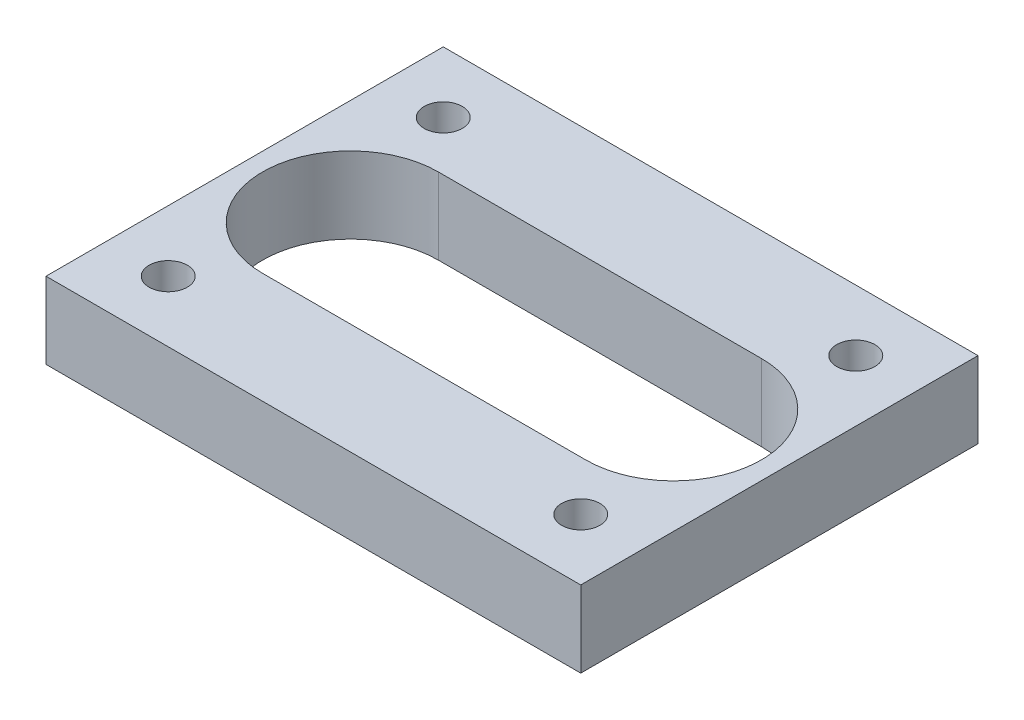
ISO-10303-21;
HEADER;
FILE_DESCRIPTION(('STEP AP214'),'2;1');
FILE_NAME('part.step','',(''),(''),'','','');
FILE_SCHEMA(('AUTOMOTIVE_DESIGN { 1 0 10303 214 1 1 1 1 }'));
ENDSEC;
DATA;
#1=APPLICATION_CONTEXT('core data for automotive mechanical design processes');
#2=APPLICATION_PROTOCOL_DEFINITION('international standard','automotive_design',2000,#1);
#3=PRODUCT_CONTEXT('',#1,'mechanical');
#4=PRODUCT('Part','Part','',(#3));
#5=PRODUCT_RELATED_PRODUCT_CATEGORY('part','',(#4));
#6=PRODUCT_DEFINITION_FORMATION('','',#4);
#7=PRODUCT_DEFINITION_CONTEXT('part definition',#1,'design');
#8=PRODUCT_DEFINITION('design','',#6,#7);
#9=PRODUCT_DEFINITION_SHAPE('','',#8);
#10=(LENGTH_UNIT() NAMED_UNIT(*) SI_UNIT(.MILLI.,.METRE.));
#11=(NAMED_UNIT(*) PLANE_ANGLE_UNIT() SI_UNIT($,.RADIAN.));
#12=(NAMED_UNIT(*) SI_UNIT($,.STERADIAN.) SOLID_ANGLE_UNIT());
#13=UNCERTAINTY_MEASURE_WITH_UNIT(LENGTH_MEASURE(1.E-05),#10,'distance_accuracy_value','');
#14=(GEOMETRIC_REPRESENTATION_CONTEXT(3) GLOBAL_UNCERTAINTY_ASSIGNED_CONTEXT((#13)) GLOBAL_UNIT_ASSIGNED_CONTEXT((#10,
#11,#12)) REPRESENTATION_CONTEXT('',''));
#15=CARTESIAN_POINT('',(0.,0.,0.));
#16=DIRECTION('',(0.,0.,1.));
#17=DIRECTION('',(1.,0.,0.));
#18=AXIS2_PLACEMENT_3D('',#15,#16,#17);
#19=CARTESIAN_POINT('',(0.,130.,86.));
#20=DIRECTION('',(0.,0.,-1.));
#21=DIRECTION('',(-1.,0.,0.));
#22=AXIS2_PLACEMENT_3D('',#19,#20,#21);
#23=PLANE('',#22);
#24=DIRECTION('',(-1.,0.,0.));
#25=VECTOR('',#24,1.);
#26=CARTESIAN_POINT('',(0.,140.,86.));
#27=LINE('',#26,#25);
#28=CARTESIAN_POINT('',(-147.526760947637,140.,86.));
#29=VERTEX_POINT('',#28);
#30=CARTESIAN_POINT('',(-217.526760947637,140.,86.));
#31=VERTEX_POINT('',#30);
#32=EDGE_CURVE('E61',#29,#31,#27,.T.);
#33=ORIENTED_EDGE('',*,*,#32,.T.);
#34=DIRECTION('',(0.,1.,0.));
#35=VECTOR('',#34,1.);
#36=CARTESIAN_POINT('',(-217.526760947637,130.,86.));
#37=LINE('',#36,#35);
#38=CARTESIAN_POINT('',(-217.526760947637,130.,86.));
#39=VERTEX_POINT('',#38);
#40=EDGE_CURVE('E164',#39,#31,#37,.T.);
#41=ORIENTED_EDGE('',*,*,#40,.F.);
#42=DIRECTION('',(-1.,0.,0.));
#43=VECTOR('',#42,1.);
#44=CARTESIAN_POINT('',(0.,130.,86.));
#45=LINE('',#44,#43);
#46=CARTESIAN_POINT('',(-147.526760947637,130.,86.));
#47=VERTEX_POINT('',#46);
#48=EDGE_CURVE('E138',#47,#39,#45,.T.);
#49=ORIENTED_EDGE('',*,*,#48,.F.);
#50=DIRECTION('',(0.,1.,0.));
#51=VECTOR('',#50,1.);
#52=CARTESIAN_POINT('',(-147.526760947637,130.,86.));
#53=LINE('',#52,#51);
#54=EDGE_CURVE('E159',#47,#29,#53,.T.);
#55=ORIENTED_EDGE('',*,*,#54,.T.);
#56=EDGE_LOOP('',(#33,#41,#49,#55));
#57=FACE_BOUND('',#56,.T.);
#58=ADVANCED_FACE('F39',(#57),#23,.F.);
#59=CARTESIAN_POINT('',(-217.526760947637,130.,0.));
#60=DIRECTION('',(1.,0.,0.));
#61=DIRECTION('',(0.,0.,-1.));
#62=AXIS2_PLACEMENT_3D('',#59,#60,#61);
#63=PLANE('',#62);
#64=DIRECTION('',(0.,0.,-1.));
#65=VECTOR('',#64,1.);
#66=CARTESIAN_POINT('',(-217.526760947637,140.,0.));
#67=LINE('',#66,#65);
#68=CARTESIAN_POINT('',(-217.526760947637,140.,34.));
#69=VERTEX_POINT('',#68);
#70=EDGE_CURVE('E125',#31,#69,#67,.T.);
#71=ORIENTED_EDGE('',*,*,#70,.T.);
#72=DIRECTION('',(0.,1.,0.));
#73=VECTOR('',#72,1.);
#74=CARTESIAN_POINT('',(-217.526760947637,130.,34.));
#75=LINE('',#74,#73);
#76=CARTESIAN_POINT('',(-217.526760947637,130.,34.));
#77=VERTEX_POINT('',#76);
#78=EDGE_CURVE('E162',#77,#69,#75,.T.);
#79=ORIENTED_EDGE('',*,*,#78,.F.);
#80=DIRECTION('',(0.,0.,-1.));
#81=VECTOR('',#80,1.);
#82=CARTESIAN_POINT('',(-217.526760947637,130.,0.));
#83=LINE('',#82,#81);
#84=EDGE_CURVE('E141',#39,#77,#83,.T.);
#85=ORIENTED_EDGE('',*,*,#84,.F.);
#86=ORIENTED_EDGE('',*,*,#40,.T.);
#87=EDGE_LOOP('',(#71,#79,#85,#86));
#88=FACE_BOUND('',#87,.T.);
#89=ADVANCED_FACE('F187',(#88),#63,.F.);
#90=CARTESIAN_POINT('',(-161.376760947637,130.,60.));
#91=DIRECTION('',(0.,1.,0.));
#92=DIRECTION('',(0.,0.,1.));
#93=AXIS2_PLACEMENT_3D('',#90,#91,#92);
#94=CYLINDRICAL_SURFACE('',#93,11.5);
#95=CARTESIAN_POINT('',(-161.376760947637,140.,60.));
#96=DIRECTION('',(0.,-1.,0.));
#97=DIRECTION('',(0.,0.,-1.));
#98=AXIS2_PLACEMENT_3D('',#95,#96,#97);
#99=CIRCLE('',#98,11.5);
#100=CARTESIAN_POINT('',(-161.376760947637,140.,48.5));
#101=VERTEX_POINT('',#100);
#102=CARTESIAN_POINT('',(-161.376760947637,140.,71.5));
#103=VERTEX_POINT('',#102);
#104=EDGE_CURVE('E151',#101,#103,#99,.T.);
#105=ORIENTED_EDGE('',*,*,#104,.F.);
#106=DIRECTION('',(0.,1.,0.));
#107=VECTOR('',#106,1.);
#108=CARTESIAN_POINT('',(-161.376760947637,130.,48.5));
#109=LINE('',#108,#107);
#110=CARTESIAN_POINT('',(-161.376760947637,130.,48.5));
#111=VERTEX_POINT('',#110);
#112=EDGE_CURVE('E170',#111,#101,#109,.T.);
#113=ORIENTED_EDGE('',*,*,#112,.F.);
#114=CARTESIAN_POINT('',(-161.376760947637,130.,60.));
#115=DIRECTION('',(0.,-1.,0.));
#116=DIRECTION('',(0.,0.,-1.));
#117=AXIS2_PLACEMENT_3D('',#114,#115,#116);
#118=CIRCLE('',#117,11.5);
#119=CARTESIAN_POINT('',(-161.376760947637,130.,71.5));
#120=VERTEX_POINT('',#119);
#121=EDGE_CURVE('E129',#111,#120,#118,.T.);
#122=ORIENTED_EDGE('',*,*,#121,.T.);
#123=DIRECTION('',(0.,1.,0.));
#124=VECTOR('',#123,1.);
#125=CARTESIAN_POINT('',(-161.376760947637,130.,71.5));
#126=LINE('',#125,#124);
#127=EDGE_CURVE('E114',#120,#103,#126,.T.);
#128=ORIENTED_EDGE('',*,*,#127,.T.);
#129=EDGE_LOOP('',(#105,#113,#122,#128));
#130=FACE_BOUND('',#129,.T.);
#131=ADVANCED_FACE('F173',(#130),#94,.F.);
#132=CARTESIAN_POINT('',(0.,130.,48.5));
#133=DIRECTION('',(0.,0.,-1.));
#134=DIRECTION('',(-1.,0.,0.));
#135=AXIS2_PLACEMENT_3D('',#132,#133,#134);
#136=PLANE('',#135);
#137=DIRECTION('',(-1.,0.,0.));
#138=VECTOR('',#137,1.);
#139=CARTESIAN_POINT('',(0.,140.,48.5));
#140=LINE('',#139,#138);
#141=CARTESIAN_POINT('',(-203.676760947637,140.,48.5));
#142=VERTEX_POINT('',#141);
#143=EDGE_CURVE('E153',#101,#142,#140,.T.);
#144=ORIENTED_EDGE('',*,*,#143,.T.);
#145=DIRECTION('',(0.,1.,0.));
#146=VECTOR('',#145,1.);
#147=CARTESIAN_POINT('',(-203.676760947637,130.,48.5));
#148=LINE('',#147,#146);
#149=CARTESIAN_POINT('',(-203.676760947637,130.,48.5));
#150=VERTEX_POINT('',#149);
#151=EDGE_CURVE('E146',#150,#142,#148,.T.);
#152=ORIENTED_EDGE('',*,*,#151,.F.);
#153=DIRECTION('',(-1.,0.,0.));
#154=VECTOR('',#153,1.);
#155=CARTESIAN_POINT('',(0.,130.,48.5));
#156=LINE('',#155,#154);
#157=EDGE_CURVE('E123',#111,#150,#156,.T.);
#158=ORIENTED_EDGE('',*,*,#157,.F.);
#159=ORIENTED_EDGE('',*,*,#112,.T.);
#160=EDGE_LOOP('',(#144,#152,#158,#159));
#161=FACE_BOUND('',#160,.T.);
#162=ADVANCED_FACE('F178',(#161),#136,.F.);
#163=CARTESIAN_POINT('',(0.,130.,0.));
#164=DIRECTION('',(0.,-1.,0.));
#165=DIRECTION('',(0.,0.,-1.));
#166=AXIS2_PLACEMENT_3D('',#163,#164,#165);
#167=PLANE('',#166);
#168=CARTESIAN_POINT('',(-155.526760947637,130.,42.));
#169=DIRECTION('',(0.,1.,0.));
#170=DIRECTION('',(0.,0.,1.));
#171=AXIS2_PLACEMENT_3D('',#168,#169,#170);
#172=CIRCLE('',#171,2.5);
#173=CARTESIAN_POINT('',(-155.526760947637,130.,44.5));
#174=VERTEX_POINT('',#173);
#175=EDGE_CURVE('E284',#174,#174,#172,.T.);
#176=ORIENTED_EDGE('',*,*,#175,.T.);
#177=EDGE_LOOP('',(#176));
#178=FACE_BOUND('',#177,.T.);
#179=CARTESIAN_POINT('',(-209.526760947637,130.,78.));
#180=DIRECTION('',(0.,1.,0.));
#181=DIRECTION('',(0.,0.,1.));
#182=AXIS2_PLACEMENT_3D('',#179,#180,#181);
#183=CIRCLE('',#182,2.5);
#184=CARTESIAN_POINT('',(-209.526760947637,130.,80.5));
#185=VERTEX_POINT('',#184);
#186=EDGE_CURVE('E287',#185,#185,#183,.T.);
#187=ORIENTED_EDGE('',*,*,#186,.T.);
#188=EDGE_LOOP('',(#187));
#189=FACE_BOUND('',#188,.T.);
#190=CARTESIAN_POINT('',(-155.526760947637,130.,78.));
#191=DIRECTION('',(0.,1.,0.));
#192=DIRECTION('',(0.,0.,1.));
#193=AXIS2_PLACEMENT_3D('',#190,#191,#192);
#194=CIRCLE('',#193,2.5);
#195=CARTESIAN_POINT('',(-155.526760947637,130.,80.5));
#196=VERTEX_POINT('',#195);
#197=EDGE_CURVE('E298',#196,#196,#194,.T.);
#198=ORIENTED_EDGE('',*,*,#197,.T.);
#199=EDGE_LOOP('',(#198));
#200=FACE_BOUND('',#199,.T.);
#201=CARTESIAN_POINT('',(-209.526760947637,130.,42.));
#202=DIRECTION('',(0.,1.,0.));
#203=DIRECTION('',(0.,0.,1.));
#204=AXIS2_PLACEMENT_3D('',#201,#202,#203);
#205=CIRCLE('',#204,2.5);
#206=CARTESIAN_POINT('',(-209.526760947637,130.,44.5));
#207=VERTEX_POINT('',#206);
#208=EDGE_CURVE('E149',#207,#207,#205,.T.);
#209=ORIENTED_EDGE('',*,*,#208,.T.);
#210=EDGE_LOOP('',(#209));
#211=FACE_BOUND('',#210,.T.);
#212=CARTESIAN_POINT('',(-203.676760947637,130.,60.));
#213=DIRECTION('',(0.,-1.,0.));
#214=DIRECTION('',(0.,0.,-1.));
#215=AXIS2_PLACEMENT_3D('',#212,#213,#214);
#216=CIRCLE('',#215,11.5);
#217=CARTESIAN_POINT('',(-203.676760947637,130.,71.5));
#218=VERTEX_POINT('',#217);
#219=EDGE_CURVE('E107',#218,#150,#216,.T.);
#220=ORIENTED_EDGE('',*,*,#219,.F.);
#221=DIRECTION('',(-1.,0.,0.));
#222=VECTOR('',#221,1.);
#223=CARTESIAN_POINT('',(0.,130.,71.5));
#224=LINE('',#223,#222);
#225=EDGE_CURVE('E120',#120,#218,#224,.T.);
#226=ORIENTED_EDGE('',*,*,#225,.F.);
#227=ORIENTED_EDGE('',*,*,#121,.F.);
#228=ORIENTED_EDGE('',*,*,#157,.T.);
#229=EDGE_LOOP('',(#220,#226,#227,#228));
#230=FACE_BOUND('',#229,.T.);
#231=DIRECTION('',(0.,0.,-1.));
#232=VECTOR('',#231,1.);
#233=CARTESIAN_POINT('',(-147.526760947637,130.,0.));
#234=LINE('',#233,#232);
#235=CARTESIAN_POINT('',(-147.526760947637,130.,34.));
#236=VERTEX_POINT('',#235);
#237=EDGE_CURVE('E135',#47,#236,#234,.T.);
#238=ORIENTED_EDGE('',*,*,#237,.F.);
#239=ORIENTED_EDGE('',*,*,#48,.T.);
#240=ORIENTED_EDGE('',*,*,#84,.T.);
#241=DIRECTION('',(-1.,0.,0.));
#242=VECTOR('',#241,1.);
#243=CARTESIAN_POINT('',(0.,130.,34.));
#244=LINE('',#243,#242);
#245=EDGE_CURVE('E143',#236,#77,#244,.T.);
#246=ORIENTED_EDGE('',*,*,#245,.F.);
#247=EDGE_LOOP('',(#238,#239,#240,#246));
#248=FACE_BOUND('',#247,.T.);
#249=ADVANCED_FACE('F117',(#178,#189,#200,#211,#230,#248),#167,.T.);
#250=CARTESIAN_POINT('',(0.,130.,71.5));
#251=DIRECTION('',(0.,0.,-1.));
#252=DIRECTION('',(-1.,0.,0.));
#253=AXIS2_PLACEMENT_3D('',#250,#251,#252);
#254=PLANE('',#253);
#255=DIRECTION('',(-1.,0.,0.));
#256=VECTOR('',#255,1.);
#257=CARTESIAN_POINT('',(0.,140.,71.5));
#258=LINE('',#257,#256);
#259=CARTESIAN_POINT('',(-203.676760947637,140.,71.5));
#260=VERTEX_POINT('',#259);
#261=EDGE_CURVE('E148',#103,#260,#258,.T.);
#262=ORIENTED_EDGE('',*,*,#261,.F.);
#263=ORIENTED_EDGE('',*,*,#127,.F.);
#264=ORIENTED_EDGE('',*,*,#225,.T.);
#265=DIRECTION('',(0.,1.,0.));
#266=VECTOR('',#265,1.);
#267=CARTESIAN_POINT('',(-203.676760947637,130.,71.5));
#268=LINE('',#267,#266);
#269=EDGE_CURVE('E43',#218,#260,#268,.T.);
#270=ORIENTED_EDGE('',*,*,#269,.T.);
#271=EDGE_LOOP('',(#262,#263,#264,#270));
#272=FACE_BOUND('',#271,.T.);
#273=ADVANCED_FACE('F127',(#272),#254,.T.);
#274=CARTESIAN_POINT('',(-203.676760947637,130.,60.));
#275=DIRECTION('',(0.,1.,0.));
#276=DIRECTION('',(0.,0.,1.));
#277=AXIS2_PLACEMENT_3D('',#274,#275,#276);
#278=CYLINDRICAL_SURFACE('',#277,11.5);
#279=CARTESIAN_POINT('',(-203.676760947637,140.,60.));
#280=DIRECTION('',(0.,-1.,0.));
#281=DIRECTION('',(0.,0.,-1.));
#282=AXIS2_PLACEMENT_3D('',#279,#280,#281);
#283=CIRCLE('',#282,11.5);
#284=EDGE_CURVE('E108',#260,#142,#283,.T.);
#285=ORIENTED_EDGE('',*,*,#284,.F.);
#286=ORIENTED_EDGE('',*,*,#269,.F.);
#287=ORIENTED_EDGE('',*,*,#219,.T.);
#288=ORIENTED_EDGE('',*,*,#151,.T.);
#289=EDGE_LOOP('',(#285,#286,#287,#288));
#290=FACE_BOUND('',#289,.T.);
#291=ADVANCED_FACE('F41',(#290),#278,.F.);
#292=CARTESIAN_POINT('',(-147.526760947637,130.,0.));
#293=DIRECTION('',(1.,0.,0.));
#294=DIRECTION('',(0.,0.,-1.));
#295=AXIS2_PLACEMENT_3D('',#292,#293,#294);
#296=PLANE('',#295);
#297=DIRECTION('',(0.,0.,-1.));
#298=VECTOR('',#297,1.);
#299=CARTESIAN_POINT('',(-147.526760947637,140.,0.));
#300=LINE('',#299,#298);
#301=CARTESIAN_POINT('',(-147.526760947637,140.,34.));
#302=VERTEX_POINT('',#301);
#303=EDGE_CURVE('E11',#29,#302,#300,.T.);
#304=ORIENTED_EDGE('',*,*,#303,.F.);
#305=ORIENTED_EDGE('',*,*,#54,.F.);
#306=ORIENTED_EDGE('',*,*,#237,.T.);
#307=DIRECTION('',(0.,1.,0.));
#308=VECTOR('',#307,1.);
#309=CARTESIAN_POINT('',(-147.526760947637,130.,34.));
#310=LINE('',#309,#308);
#311=EDGE_CURVE('E113',#236,#302,#310,.T.);
#312=ORIENTED_EDGE('',*,*,#311,.T.);
#313=EDGE_LOOP('',(#304,#305,#306,#312));
#314=FACE_BOUND('',#313,.T.);
#315=ADVANCED_FACE('F202',(#314),#296,.T.);
#316=CARTESIAN_POINT('',(0.,130.,34.));
#317=DIRECTION('',(0.,0.,-1.));
#318=DIRECTION('',(-1.,0.,0.));
#319=AXIS2_PLACEMENT_3D('',#316,#317,#318);
#320=PLANE('',#319);
#321=DIRECTION('',(-1.,0.,0.));
#322=VECTOR('',#321,1.);
#323=CARTESIAN_POINT('',(0.,140.,34.));
#324=LINE('',#323,#322);
#325=EDGE_CURVE('E48',#302,#69,#324,.T.);
#326=ORIENTED_EDGE('',*,*,#325,.F.);
#327=ORIENTED_EDGE('',*,*,#311,.F.);
#328=ORIENTED_EDGE('',*,*,#245,.T.);
#329=ORIENTED_EDGE('',*,*,#78,.T.);
#330=EDGE_LOOP('',(#326,#327,#328,#329));
#331=FACE_BOUND('',#330,.T.);
#332=ADVANCED_FACE('F192',(#331),#320,.T.);
#333=CARTESIAN_POINT('',(0.,140.,0.));
#334=DIRECTION('',(0.,-1.,0.));
#335=DIRECTION('',(0.,0.,-1.));
#336=AXIS2_PLACEMENT_3D('',#333,#334,#335);
#337=PLANE('',#336);
#338=CARTESIAN_POINT('',(-155.526760947637,140.,42.));
#339=DIRECTION('',(0.,1.,0.));
#340=DIRECTION('',(0.,0.,1.));
#341=AXIS2_PLACEMENT_3D('',#338,#339,#340);
#342=CIRCLE('',#341,2.5);
#343=CARTESIAN_POINT('',(-155.526760947637,140.,44.5));
#344=VERTEX_POINT('',#343);
#345=EDGE_CURVE('E286',#344,#344,#342,.T.);
#346=ORIENTED_EDGE('',*,*,#345,.F.);
#347=EDGE_LOOP('',(#346));
#348=FACE_BOUND('',#347,.T.);
#349=CARTESIAN_POINT('',(-209.526760947637,140.,78.));
#350=DIRECTION('',(0.,1.,0.));
#351=DIRECTION('',(0.,0.,1.));
#352=AXIS2_PLACEMENT_3D('',#349,#350,#351);
#353=CIRCLE('',#352,2.5);
#354=CARTESIAN_POINT('',(-209.526760947637,140.,80.5));
#355=VERTEX_POINT('',#354);
#356=EDGE_CURVE('E292',#355,#355,#353,.T.);
#357=ORIENTED_EDGE('',*,*,#356,.F.);
#358=EDGE_LOOP('',(#357));
#359=FACE_BOUND('',#358,.T.);
#360=CARTESIAN_POINT('',(-155.526760947637,140.,78.));
#361=DIRECTION('',(0.,1.,0.));
#362=DIRECTION('',(0.,0.,1.));
#363=AXIS2_PLACEMENT_3D('',#360,#361,#362);
#364=CIRCLE('',#363,2.5);
#365=CARTESIAN_POINT('',(-155.526760947637,140.,80.5));
#366=VERTEX_POINT('',#365);
#367=EDGE_CURVE('E309',#366,#366,#364,.T.);
#368=ORIENTED_EDGE('',*,*,#367,.F.);
#369=EDGE_LOOP('',(#368));
#370=FACE_BOUND('',#369,.T.);
#371=CARTESIAN_POINT('',(-209.526760947637,140.,42.));
#372=DIRECTION('',(0.,1.,0.));
#373=DIRECTION('',(0.,0.,1.));
#374=AXIS2_PLACEMENT_3D('',#371,#372,#373);
#375=CIRCLE('',#374,2.5);
#376=CARTESIAN_POINT('',(-209.526760947637,140.,44.5));
#377=VERTEX_POINT('',#376);
#378=EDGE_CURVE('E289',#377,#377,#375,.T.);
#379=ORIENTED_EDGE('',*,*,#378,.F.);
#380=EDGE_LOOP('',(#379));
#381=FACE_BOUND('',#380,.T.);
#382=ORIENTED_EDGE('',*,*,#104,.T.);
#383=ORIENTED_EDGE('',*,*,#261,.T.);
#384=ORIENTED_EDGE('',*,*,#284,.T.);
#385=ORIENTED_EDGE('',*,*,#143,.F.);
#386=EDGE_LOOP('',(#382,#383,#384,#385));
#387=FACE_BOUND('',#386,.T.);
#388=ORIENTED_EDGE('',*,*,#303,.T.);
#389=ORIENTED_EDGE('',*,*,#325,.T.);
#390=ORIENTED_EDGE('',*,*,#70,.F.);
#391=ORIENTED_EDGE('',*,*,#32,.F.);
#392=EDGE_LOOP('',(#388,#389,#390,#391));
#393=FACE_BOUND('',#392,.T.);
#394=ADVANCED_FACE('F175',(#348,#359,#370,#381,#387,#393),#337,.F.);
#395=CARTESIAN_POINT('',(-209.526760947637,130.,42.));
#396=DIRECTION('',(0.,1.,0.));
#397=DIRECTION('',(0.,0.,1.));
#398=AXIS2_PLACEMENT_3D('',#395,#396,#397);
#399=CYLINDRICAL_SURFACE('',#398,2.5);
#400=ORIENTED_EDGE('',*,*,#208,.F.);
#401=EDGE_LOOP('',(#400));
#402=FACE_BOUND('',#401,.T.);
#403=ORIENTED_EDGE('',*,*,#378,.T.);
#404=EDGE_LOOP('',(#403));
#405=FACE_BOUND('',#404,.T.);
#406=ADVANCED_FACE('F191',(#402,#405),#399,.F.);
#407=CARTESIAN_POINT('',(-155.526760947637,130.,78.));
#408=DIRECTION('',(0.,1.,0.));
#409=DIRECTION('',(0.,0.,1.));
#410=AXIS2_PLACEMENT_3D('',#407,#408,#409);
#411=CYLINDRICAL_SURFACE('',#410,2.5);
#412=ORIENTED_EDGE('',*,*,#197,.F.);
#413=EDGE_LOOP('',(#412));
#414=FACE_BOUND('',#413,.T.);
#415=ORIENTED_EDGE('',*,*,#367,.T.);
#416=EDGE_LOOP('',(#415));
#417=FACE_BOUND('',#416,.T.);
#418=ADVANCED_FACE('F199',(#414,#417),#411,.F.);
#419=CARTESIAN_POINT('',(-209.526760947637,130.,78.));
#420=DIRECTION('',(0.,1.,0.));
#421=DIRECTION('',(0.,0.,1.));
#422=AXIS2_PLACEMENT_3D('',#419,#420,#421);
#423=CYLINDRICAL_SURFACE('',#422,2.5);
#424=ORIENTED_EDGE('',*,*,#186,.F.);
#425=EDGE_LOOP('',(#424));
#426=FACE_BOUND('',#425,.T.);
#427=ORIENTED_EDGE('',*,*,#356,.T.);
#428=EDGE_LOOP('',(#427));
#429=FACE_BOUND('',#428,.T.);
#430=ADVANCED_FACE('F257',(#426,#429),#423,.F.);
#431=CARTESIAN_POINT('',(-155.526760947637,130.,42.));
#432=DIRECTION('',(0.,1.,0.));
#433=DIRECTION('',(0.,0.,1.));
#434=AXIS2_PLACEMENT_3D('',#431,#432,#433);
#435=CYLINDRICAL_SURFACE('',#434,2.5);
#436=ORIENTED_EDGE('',*,*,#175,.F.);
#437=EDGE_LOOP('',(#436));
#438=FACE_BOUND('',#437,.T.);
#439=ORIENTED_EDGE('',*,*,#345,.T.);
#440=EDGE_LOOP('',(#439));
#441=FACE_BOUND('',#440,.T.);
#442=ADVANCED_FACE('F267',(#438,#441),#435,.F.);
#443=CLOSED_SHELL('',(#58,#89,#131,#162,#249,#273,#291,#315,#332,#394,#406,#418,#430,#442));
#444=MANIFOLD_SOLID_BREP('B2',#443);
#445=ADVANCED_BREP_SHAPE_REPRESENTATION('',(#18,#444),#14);
#446=SHAPE_DEFINITION_REPRESENTATION(#9,#445);
ENDSEC;
END-ISO-10303-21;
